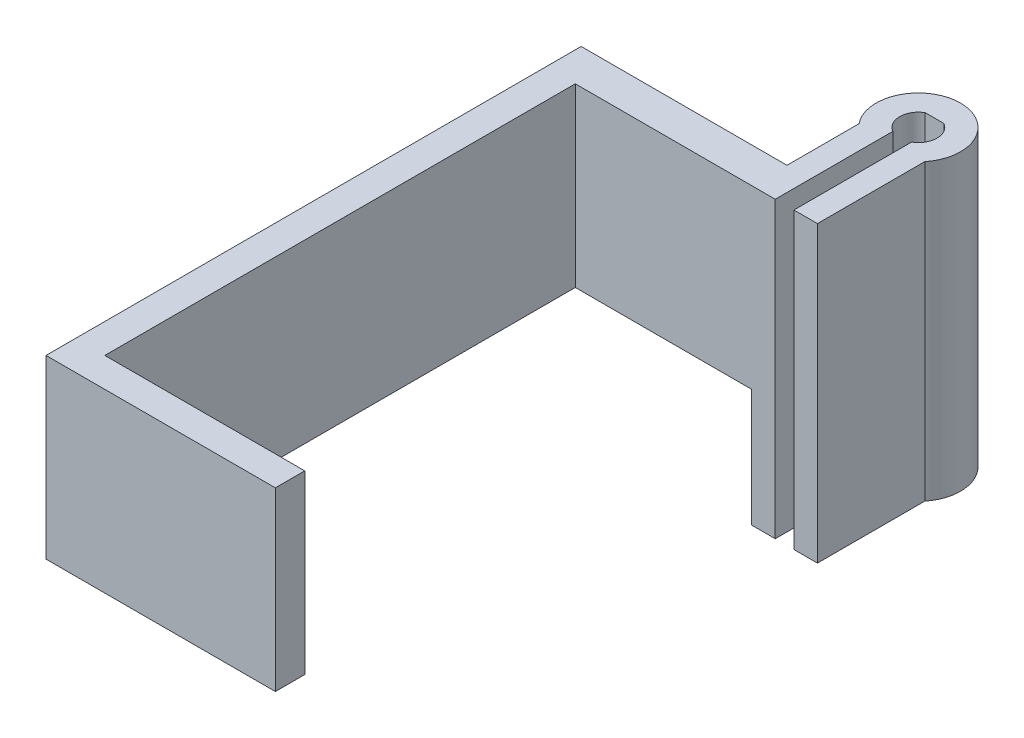
ISO-10303-21;
HEADER;
FILE_DESCRIPTION(('STEP AP214'),'2;1');
FILE_NAME('part.step','',(''),(''),'','','');
FILE_SCHEMA(('AUTOMOTIVE_DESIGN { 1 0 10303 214 1 1 1 1 }'));
ENDSEC;
DATA;
#1=APPLICATION_CONTEXT('core data for automotive mechanical design processes');
#2=APPLICATION_PROTOCOL_DEFINITION('international standard','automotive_design',2000,#1);
#3=PRODUCT_CONTEXT('',#1,'mechanical');
#4=PRODUCT('Part','Part','',(#3));
#5=PRODUCT_RELATED_PRODUCT_CATEGORY('part','',(#4));
#6=PRODUCT_DEFINITION_FORMATION('','',#4);
#7=PRODUCT_DEFINITION_CONTEXT('part definition',#1,'design');
#8=PRODUCT_DEFINITION('design','',#6,#7);
#9=PRODUCT_DEFINITION_SHAPE('','',#8);
#10=(LENGTH_UNIT() NAMED_UNIT(*) SI_UNIT(.MILLI.,.METRE.));
#11=(NAMED_UNIT(*) PLANE_ANGLE_UNIT() SI_UNIT($,.RADIAN.));
#12=(NAMED_UNIT(*) SI_UNIT($,.STERADIAN.) SOLID_ANGLE_UNIT());
#13=UNCERTAINTY_MEASURE_WITH_UNIT(LENGTH_MEASURE(1.E-05),#10,'distance_accuracy_value','');
#14=(GEOMETRIC_REPRESENTATION_CONTEXT(3) GLOBAL_UNCERTAINTY_ASSIGNED_CONTEXT((#13)) GLOBAL_UNIT_ASSIGNED_CONTEXT((#10,
#11,#12)) REPRESENTATION_CONTEXT('',''));
#15=CARTESIAN_POINT('',(0.,0.,0.));
#16=DIRECTION('',(0.,0.,1.));
#17=DIRECTION('',(1.,0.,0.));
#18=AXIS2_PLACEMENT_3D('',#15,#16,#17);
#19=CARTESIAN_POINT('',(0.,50.,0.));
#20=DIRECTION('',(0.,-1.,0.));
#21=DIRECTION('',(0.,0.,-1.));
#22=AXIS2_PLACEMENT_3D('',#19,#20,#21);
#23=CYLINDRICAL_SURFACE('',#22,3.175);
#24=CARTESIAN_POINT('',(0.,0.,0.));
#25=DIRECTION('',(0.,-1.,0.));
#26=DIRECTION('',(0.,0.,1.));
#27=AXIS2_PLACEMENT_3D('',#24,#25,#26);
#28=CIRCLE('',#27,3.175);
#29=CARTESIAN_POINT('',(1.5875,0.,-2.74963065701559));
#30=VERTEX_POINT('',#29);
#31=CARTESIAN_POINT('',(1.5875,0.,2.74963065701559));
#32=VERTEX_POINT('',#31);
#33=EDGE_CURVE('E147',#30,#32,#28,.T.);
#34=ORIENTED_EDGE('',*,*,#33,.T.);
#35=DIRECTION('',(0.,-1.,0.));
#36=VECTOR('',#35,1.);
#37=CARTESIAN_POINT('',(1.5875,50.,2.74963065701559));
#38=LINE('',#37,#36);
#39=CARTESIAN_POINT('',(1.5875,50.,2.74963065701559));
#40=VERTEX_POINT('',#39);
#41=EDGE_CURVE('E11',#40,#32,#38,.T.);
#42=ORIENTED_EDGE('',*,*,#41,.F.);
#43=CARTESIAN_POINT('',(0.,50.,0.));
#44=DIRECTION('',(0.,-1.,0.));
#45=DIRECTION('',(0.,0.,1.));
#46=AXIS2_PLACEMENT_3D('',#43,#44,#45);
#47=CIRCLE('',#46,3.175);
#48=CARTESIAN_POINT('',(1.5875,50.,-2.74963065701559));
#49=VERTEX_POINT('',#48);
#50=EDGE_CURVE('E167',#49,#40,#47,.T.);
#51=ORIENTED_EDGE('',*,*,#50,.F.);
#52=DIRECTION('',(0.,-1.,0.));
#53=VECTOR('',#52,1.);
#54=CARTESIAN_POINT('',(1.5875,50.,-2.74963065701559));
#55=LINE('',#54,#53);
#56=EDGE_CURVE('E143',#49,#30,#55,.T.);
#57=ORIENTED_EDGE('',*,*,#56,.T.);
#58=EDGE_LOOP('',(#34,#42,#51,#57));
#59=FACE_BOUND('',#58,.T.);
#60=ADVANCED_FACE('F37',(#59),#23,.F.);
#61=CARTESIAN_POINT('',(1.5875,50.,2.74963065701559));
#62=DIRECTION('',(1.,0.,0.));
#63=DIRECTION('',(0.,0.,-1.));
#64=AXIS2_PLACEMENT_3D('',#61,#62,#63);
#65=PLANE('',#64);
#66=DIRECTION('',(0.,0.,1.));
#67=VECTOR('',#66,1.);
#68=CARTESIAN_POINT('',(1.5875,0.,2.74963065701559));
#69=LINE('',#68,#67);
#70=CARTESIAN_POINT('',(1.5875,0.,22.7496306570156));
#71=VERTEX_POINT('',#70);
#72=EDGE_CURVE('E150',#32,#71,#69,.T.);
#73=ORIENTED_EDGE('',*,*,#72,.T.);
#74=DIRECTION('',(0.,-1.,0.));
#75=VECTOR('',#74,1.);
#76=CARTESIAN_POINT('',(1.5875,50.,22.7496306570156));
#77=LINE('',#76,#75);
#78=CARTESIAN_POINT('',(1.5875,50.,22.7496306570156));
#79=VERTEX_POINT('',#78);
#80=EDGE_CURVE('E45',#79,#71,#77,.T.);
#81=ORIENTED_EDGE('',*,*,#80,.F.);
#82=DIRECTION('',(0.,0.,1.));
#83=VECTOR('',#82,1.);
#84=CARTESIAN_POINT('',(1.5875,50.,2.74963065701559));
#85=LINE('',#84,#83);
#86=EDGE_CURVE('E103',#40,#79,#85,.T.);
#87=ORIENTED_EDGE('',*,*,#86,.F.);
#88=ORIENTED_EDGE('',*,*,#41,.T.);
#89=EDGE_LOOP('',(#73,#81,#87,#88));
#90=FACE_BOUND('',#89,.T.);
#91=ADVANCED_FACE('F352',(#90),#65,.F.);
#92=CARTESIAN_POINT('',(1.5875,50.,22.7496306570156));
#93=DIRECTION('',(0.,0.,-1.));
#94=DIRECTION('',(-1.,0.,0.));
#95=AXIS2_PLACEMENT_3D('',#92,#93,#94);
#96=PLANE('',#95);
#97=DIRECTION('',(1.,0.,0.));
#98=VECTOR('',#97,1.);
#99=CARTESIAN_POINT('',(1.5875,0.,22.7496306570156));
#100=LINE('',#99,#98);
#101=CARTESIAN_POINT('',(5.5875,0.,22.7496306570156));
#102=VERTEX_POINT('',#101);
#103=EDGE_CURVE('E153',#71,#102,#100,.T.);
#104=ORIENTED_EDGE('',*,*,#103,.T.);
#105=DIRECTION('',(0.,-1.,0.));
#106=VECTOR('',#105,1.);
#107=CARTESIAN_POINT('',(5.5875,50.,22.7496306570156));
#108=LINE('',#107,#106);
#109=CARTESIAN_POINT('',(5.5875,50.,22.7496306570156));
#110=VERTEX_POINT('',#109);
#111=EDGE_CURVE('E179',#110,#102,#108,.T.);
#112=ORIENTED_EDGE('',*,*,#111,.F.);
#113=DIRECTION('',(1.,0.,0.));
#114=VECTOR('',#113,1.);
#115=CARTESIAN_POINT('',(1.5875,50.,22.7496306570156));
#116=LINE('',#115,#114);
#117=EDGE_CURVE('E187',#79,#110,#116,.T.);
#118=ORIENTED_EDGE('',*,*,#117,.F.);
#119=ORIENTED_EDGE('',*,*,#80,.T.);
#120=EDGE_LOOP('',(#104,#112,#118,#119));
#121=FACE_BOUND('',#120,.T.);
#122=ADVANCED_FACE('F185',(#121),#96,.F.);
#123=CARTESIAN_POINT('',(5.5875,50.,4.50116304414759));
#124=DIRECTION('',(-1.,0.,0.));
#125=DIRECTION('',(0.,0.,1.));
#126=AXIS2_PLACEMENT_3D('',#123,#124,#125);
#127=PLANE('',#126);
#128=DIRECTION('',(0.,0.,-1.));
#129=VECTOR('',#128,1.);
#130=CARTESIAN_POINT('',(5.5875,0.,4.50116304414759));
#131=LINE('',#130,#129);
#132=CARTESIAN_POINT('',(5.5875,0.,4.50116304414759));
#133=VERTEX_POINT('',#132);
#134=EDGE_CURVE('E155',#102,#133,#131,.T.);
#135=ORIENTED_EDGE('',*,*,#134,.T.);
#136=DIRECTION('',(0.,-1.,0.));
#137=VECTOR('',#136,1.);
#138=CARTESIAN_POINT('',(5.5875,50.,4.50116304414759));
#139=LINE('',#138,#137);
#140=CARTESIAN_POINT('',(5.5875,50.,4.50116304414759));
#141=VERTEX_POINT('',#140);
#142=EDGE_CURVE('E176',#141,#133,#139,.T.);
#143=ORIENTED_EDGE('',*,*,#142,.F.);
#144=DIRECTION('',(0.,0.,-1.));
#145=VECTOR('',#144,1.);
#146=CARTESIAN_POINT('',(5.5875,50.,4.50116304414759));
#147=LINE('',#146,#145);
#148=EDGE_CURVE('E206',#110,#141,#147,.T.);
#149=ORIENTED_EDGE('',*,*,#148,.F.);
#150=ORIENTED_EDGE('',*,*,#111,.T.);
#151=EDGE_LOOP('',(#135,#143,#149,#150));
#152=FACE_BOUND('',#151,.T.);
#153=ADVANCED_FACE('F196',(#152),#127,.F.);
#154=CARTESIAN_POINT('',(0.,50.,0.));
#155=DIRECTION('',(0.,-1.,0.));
#156=DIRECTION('',(0.,0.,-1.));
#157=AXIS2_PLACEMENT_3D('',#154,#155,#156);
#158=CYLINDRICAL_SURFACE('',#157,7.175);
#159=CARTESIAN_POINT('',(0.,0.,0.));
#160=DIRECTION('',(0.,1.,0.));
#161=DIRECTION('',(0.,0.,1.));
#162=AXIS2_PLACEMENT_3D('',#159,#160,#161);
#163=CIRCLE('',#162,7.175);
#164=CARTESIAN_POINT('',(-5.5875,0.,4.50116304414759));
#165=VERTEX_POINT('',#164);
#166=EDGE_CURVE('E157',#133,#165,#163,.T.);
#167=ORIENTED_EDGE('',*,*,#166,.T.);
#168=DIRECTION('',(0.,-1.,0.));
#169=VECTOR('',#168,1.);
#170=CARTESIAN_POINT('',(-5.5875,50.,4.50116304414759));
#171=LINE('',#170,#169);
#172=CARTESIAN_POINT('',(-5.5875,50.,4.50116304414759));
#173=VERTEX_POINT('',#172);
#174=EDGE_CURVE('E173',#173,#165,#171,.T.);
#175=ORIENTED_EDGE('',*,*,#174,.F.);
#176=CARTESIAN_POINT('',(0.,50.,0.));
#177=DIRECTION('',(0.,1.,0.));
#178=DIRECTION('',(0.,0.,1.));
#179=AXIS2_PLACEMENT_3D('',#176,#177,#178);
#180=CIRCLE('',#179,7.175);
#181=EDGE_CURVE('E202',#141,#173,#180,.T.);
#182=ORIENTED_EDGE('',*,*,#181,.F.);
#183=ORIENTED_EDGE('',*,*,#142,.T.);
#184=EDGE_LOOP('',(#167,#175,#182,#183));
#185=FACE_BOUND('',#184,.T.);
#186=ADVANCED_FACE('F200',(#185),#158,.T.);
#187=CARTESIAN_POINT('',(-5.5875,50.,4.50116304414759));
#188=DIRECTION('',(1.,0.,0.));
#189=DIRECTION('',(0.,0.,-1.));
#190=AXIS2_PLACEMENT_3D('',#187,#188,#189);
#191=PLANE('',#190);
#192=DIRECTION('',(0.,0.,-1.));
#193=VECTOR('',#192,1.);
#194=CARTESIAN_POINT('',(-5.5875,20.,16.7496306570156));
#195=LINE('',#194,#193);
#196=CARTESIAN_POINT('',(-5.5875,20.,22.7496306570156));
#197=VERTEX_POINT('',#196);
#198=CARTESIAN_POINT('',(-5.5875,20.,16.7496306570156));
#199=VERTEX_POINT('',#198);
#200=EDGE_CURVE('E237',#197,#199,#195,.T.);
#201=ORIENTED_EDGE('',*,*,#200,.T.);
#202=DIRECTION('',(0.,1.,0.));
#203=VECTOR('',#202,1.);
#204=CARTESIAN_POINT('',(-5.5875,20.,16.7496306570156));
#205=LINE('',#204,#203);
#206=CARTESIAN_POINT('',(-5.5875,50.,16.7496306570156));
#207=VERTEX_POINT('',#206);
#208=EDGE_CURVE('E214',#199,#207,#205,.T.);
#209=ORIENTED_EDGE('',*,*,#208,.T.);
#210=DIRECTION('',(0.,0.,1.));
#211=VECTOR('',#210,1.);
#212=CARTESIAN_POINT('',(-5.5875,50.,4.50116304414759));
#213=LINE('',#212,#211);
#214=EDGE_CURVE('E205',#173,#207,#213,.T.);
#215=ORIENTED_EDGE('',*,*,#214,.F.);
#216=ORIENTED_EDGE('',*,*,#174,.T.);
#217=DIRECTION('',(0.,0.,1.));
#218=VECTOR('',#217,1.);
#219=CARTESIAN_POINT('',(-5.5875,0.,4.50116304414759));
#220=LINE('',#219,#218);
#221=CARTESIAN_POINT('',(-5.5875,0.,22.7496306570156));
#222=VERTEX_POINT('',#221);
#223=EDGE_CURVE('E159',#165,#222,#220,.T.);
#224=ORIENTED_EDGE('',*,*,#223,.T.);
#225=DIRECTION('',(0.,-1.,0.));
#226=VECTOR('',#225,1.);
#227=CARTESIAN_POINT('',(-5.5875,50.,22.7496306570156));
#228=LINE('',#227,#226);
#229=EDGE_CURVE('E171',#197,#222,#228,.T.);
#230=ORIENTED_EDGE('',*,*,#229,.F.);
#231=EDGE_LOOP('',(#201,#209,#215,#216,#224,#230));
#232=FACE_BOUND('',#231,.T.);
#233=ADVANCED_FACE('F278',(#232),#191,.F.);
#234=CARTESIAN_POINT('',(-5.5875,50.,22.7496306570156));
#235=DIRECTION('',(0.,0.,-1.));
#236=DIRECTION('',(-1.,0.,0.));
#237=AXIS2_PLACEMENT_3D('',#234,#235,#236);
#238=PLANE('',#237);
#239=DIRECTION('',(1.,0.,0.));
#240=VECTOR('',#239,1.);
#241=CARTESIAN_POINT('',(-5.5875,0.,22.7496306570156));
#242=LINE('',#241,#240);
#243=CARTESIAN_POINT('',(-1.5875,0.,22.7496306570156));
#244=VERTEX_POINT('',#243);
#245=EDGE_CURVE('E162',#222,#244,#242,.T.);
#246=ORIENTED_EDGE('',*,*,#245,.T.);
#247=DIRECTION('',(0.,-1.,0.));
#248=VECTOR('',#247,1.);
#249=CARTESIAN_POINT('',(-1.5875,50.,22.7496306570156));
#250=LINE('',#249,#248);
#251=CARTESIAN_POINT('',(-1.5875,50.,22.7496306570156));
#252=VERTEX_POINT('',#251);
#253=EDGE_CURVE('E138',#252,#244,#250,.T.);
#254=ORIENTED_EDGE('',*,*,#253,.F.);
#255=DIRECTION('',(1.,0.,0.));
#256=VECTOR('',#255,1.);
#257=CARTESIAN_POINT('',(-5.5875,50.,22.7496306570156));
#258=LINE('',#257,#256);
#259=CARTESIAN_POINT('',(-35.5875,50.,22.7496306570156));
#260=VERTEX_POINT('',#259);
#261=EDGE_CURVE('E129',#260,#252,#258,.T.);
#262=ORIENTED_EDGE('',*,*,#261,.F.);
#263=DIRECTION('',(0.,1.,0.));
#264=VECTOR('',#263,1.);
#265=CARTESIAN_POINT('',(-35.5875,20.,22.7496306570156));
#266=LINE('',#265,#264);
#267=CARTESIAN_POINT('',(-35.5875,20.,22.7496306570156));
#268=VERTEX_POINT('',#267);
#269=EDGE_CURVE('E151',#268,#260,#266,.T.);
#270=ORIENTED_EDGE('',*,*,#269,.F.);
#271=DIRECTION('',(1.,0.,0.));
#272=VECTOR('',#271,1.);
#273=CARTESIAN_POINT('',(-5.5875,20.,22.7496306570156));
#274=LINE('',#273,#272);
#275=EDGE_CURVE('E218',#268,#197,#274,.T.);
#276=ORIENTED_EDGE('',*,*,#275,.T.);
#277=ORIENTED_EDGE('',*,*,#229,.T.);
#278=EDGE_LOOP('',(#246,#254,#262,#270,#276,#277));
#279=FACE_BOUND('',#278,.T.);
#280=ADVANCED_FACE('F293',(#279),#238,.F.);
#281=CARTESIAN_POINT('',(-1.5875,50.,2.74963065701559));
#282=DIRECTION('',(-1.,0.,0.));
#283=DIRECTION('',(0.,0.,1.));
#284=AXIS2_PLACEMENT_3D('',#281,#282,#283);
#285=PLANE('',#284);
#286=DIRECTION('',(0.,0.,-1.));
#287=VECTOR('',#286,1.);
#288=CARTESIAN_POINT('',(-1.5875,0.,2.74963065701559));
#289=LINE('',#288,#287);
#290=CARTESIAN_POINT('',(-1.5875,0.,2.74963065701559));
#291=VERTEX_POINT('',#290);
#292=EDGE_CURVE('E137',#244,#291,#289,.T.);
#293=ORIENTED_EDGE('',*,*,#292,.T.);
#294=DIRECTION('',(0.,-1.,0.));
#295=VECTOR('',#294,1.);
#296=CARTESIAN_POINT('',(-1.5875,50.,2.74963065701559));
#297=LINE('',#296,#295);
#298=CARTESIAN_POINT('',(-1.5875,50.,2.74963065701559));
#299=VERTEX_POINT('',#298);
#300=EDGE_CURVE('E134',#299,#291,#297,.T.);
#301=ORIENTED_EDGE('',*,*,#300,.F.);
#302=DIRECTION('',(0.,0.,-1.));
#303=VECTOR('',#302,1.);
#304=CARTESIAN_POINT('',(-1.5875,50.,2.74963065701559));
#305=LINE('',#304,#303);
#306=EDGE_CURVE('E122',#252,#299,#305,.T.);
#307=ORIENTED_EDGE('',*,*,#306,.F.);
#308=ORIENTED_EDGE('',*,*,#253,.T.);
#309=EDGE_LOOP('',(#293,#301,#307,#308));
#310=FACE_BOUND('',#309,.T.);
#311=ADVANCED_FACE('F135',(#310),#285,.F.);
#312=CARTESIAN_POINT('',(0.,50.,0.));
#313=DIRECTION('',(0.,-1.,0.));
#314=DIRECTION('',(0.,0.,-1.));
#315=AXIS2_PLACEMENT_3D('',#312,#313,#314);
#316=CYLINDRICAL_SURFACE('',#315,3.175);
#317=CARTESIAN_POINT('',(0.,0.,0.));
#318=DIRECTION('',(0.,-1.,0.));
#319=DIRECTION('',(0.,0.,1.));
#320=AXIS2_PLACEMENT_3D('',#317,#318,#319);
#321=CIRCLE('',#320,3.175);
#322=CARTESIAN_POINT('',(-1.5875,0.,-2.74963065701559));
#323=VERTEX_POINT('',#322);
#324=EDGE_CURVE('E89',#291,#323,#321,.T.);
#325=ORIENTED_EDGE('',*,*,#324,.T.);
#326=DIRECTION('',(0.,-1.,0.));
#327=VECTOR('',#326,1.);
#328=CARTESIAN_POINT('',(-1.5875,50.,-2.74963065701559));
#329=LINE('',#328,#327);
#330=CARTESIAN_POINT('',(-1.5875,50.,-2.74963065701559));
#331=VERTEX_POINT('',#330);
#332=EDGE_CURVE('E139',#331,#323,#329,.T.);
#333=ORIENTED_EDGE('',*,*,#332,.F.);
#334=CARTESIAN_POINT('',(0.,50.,0.));
#335=DIRECTION('',(0.,-1.,0.));
#336=DIRECTION('',(0.,0.,1.));
#337=AXIS2_PLACEMENT_3D('',#334,#335,#336);
#338=CIRCLE('',#337,3.175);
#339=EDGE_CURVE('E126',#299,#331,#338,.T.);
#340=ORIENTED_EDGE('',*,*,#339,.F.);
#341=ORIENTED_EDGE('',*,*,#300,.T.);
#342=EDGE_LOOP('',(#325,#333,#340,#341));
#343=FACE_BOUND('',#342,.T.);
#344=ADVANCED_FACE('F141',(#343),#316,.F.);
#345=CARTESIAN_POINT('',(1.5875,50.,-2.74963065701559));
#346=DIRECTION('',(0.,0.,-1.));
#347=DIRECTION('',(-1.,0.,0.));
#348=AXIS2_PLACEMENT_3D('',#345,#346,#347);
#349=PLANE('',#348);
#350=DIRECTION('',(1.,0.,0.));
#351=VECTOR('',#350,1.);
#352=CARTESIAN_POINT('',(1.5875,0.,-2.74963065701559));
#353=LINE('',#352,#351);
#354=EDGE_CURVE('E95',#323,#30,#353,.T.);
#355=ORIENTED_EDGE('',*,*,#354,.T.);
#356=ORIENTED_EDGE('',*,*,#56,.F.);
#357=DIRECTION('',(1.,0.,0.));
#358=VECTOR('',#357,1.);
#359=CARTESIAN_POINT('',(1.5875,50.,-2.74963065701559));
#360=LINE('',#359,#358);
#361=EDGE_CURVE('E53',#331,#49,#360,.T.);
#362=ORIENTED_EDGE('',*,*,#361,.F.);
#363=ORIENTED_EDGE('',*,*,#332,.T.);
#364=EDGE_LOOP('',(#355,#356,#362,#363));
#365=FACE_BOUND('',#364,.T.);
#366=ADVANCED_FACE('F341',(#365),#349,.F.);
#367=CARTESIAN_POINT('',(0.,50.,0.));
#368=DIRECTION('',(0.,1.,0.));
#369=DIRECTION('',(0.,0.,1.));
#370=AXIS2_PLACEMENT_3D('',#367,#368,#369);
#371=PLANE('',#370);
#372=ORIENTED_EDGE('',*,*,#50,.T.);
#373=ORIENTED_EDGE('',*,*,#86,.T.);
#374=ORIENTED_EDGE('',*,*,#117,.T.);
#375=ORIENTED_EDGE('',*,*,#148,.T.);
#376=ORIENTED_EDGE('',*,*,#181,.T.);
#377=ORIENTED_EDGE('',*,*,#214,.T.);
#378=DIRECTION('',(-1.,0.,0.));
#379=VECTOR('',#378,1.);
#380=CARTESIAN_POINT('',(-40.5875,50.,16.7496306570156));
#381=LINE('',#380,#379);
#382=CARTESIAN_POINT('',(-40.5875,50.,16.7496306570156));
#383=VERTEX_POINT('',#382);
#384=EDGE_CURVE('E250',#207,#383,#381,.T.);
#385=ORIENTED_EDGE('',*,*,#384,.T.);
#386=DIRECTION('',(0.,0.,1.));
#387=VECTOR('',#386,1.);
#388=CARTESIAN_POINT('',(-40.5875,50.,107.749630657016));
#389=LINE('',#388,#387);
#390=CARTESIAN_POINT('',(-40.5875,50.,107.749630657016));
#391=VERTEX_POINT('',#390);
#392=EDGE_CURVE('E247',#383,#391,#389,.T.);
#393=ORIENTED_EDGE('',*,*,#392,.T.);
#394=DIRECTION('',(1.,0.,0.));
#395=VECTOR('',#394,1.);
#396=CARTESIAN_POINT('',(-1.58749999999999,50.,107.749630657016));
#397=LINE('',#396,#395);
#398=CARTESIAN_POINT('',(-1.58749999999999,50.,107.749630657016));
#399=VERTEX_POINT('',#398);
#400=EDGE_CURVE('E244',#391,#399,#397,.T.);
#401=ORIENTED_EDGE('',*,*,#400,.T.);
#402=DIRECTION('',(0.,0.,-1.));
#403=VECTOR('',#402,1.);
#404=CARTESIAN_POINT('',(-1.58749999999999,50.,102.749630657016));
#405=LINE('',#404,#403);
#406=CARTESIAN_POINT('',(-1.58749999999999,50.,102.749630657016));
#407=VERTEX_POINT('',#406);
#408=EDGE_CURVE('E241',#399,#407,#405,.T.);
#409=ORIENTED_EDGE('',*,*,#408,.T.);
#410=DIRECTION('',(-1.,0.,0.));
#411=VECTOR('',#410,1.);
#412=CARTESIAN_POINT('',(-35.5875,50.,102.749630657016));
#413=LINE('',#412,#411);
#414=CARTESIAN_POINT('',(-35.5875,50.,102.749630657016));
#415=VERTEX_POINT('',#414);
#416=EDGE_CURVE('E238',#407,#415,#413,.T.);
#417=ORIENTED_EDGE('',*,*,#416,.T.);
#418=DIRECTION('',(0.,0.,-1.));
#419=VECTOR('',#418,1.);
#420=CARTESIAN_POINT('',(-35.5875,50.,22.7496306570156));
#421=LINE('',#420,#419);
#422=EDGE_CURVE('E235',#415,#260,#421,.T.);
#423=ORIENTED_EDGE('',*,*,#422,.T.);
#424=ORIENTED_EDGE('',*,*,#261,.T.);
#425=ORIENTED_EDGE('',*,*,#306,.T.);
#426=ORIENTED_EDGE('',*,*,#339,.T.);
#427=ORIENTED_EDGE('',*,*,#361,.T.);
#428=EDGE_LOOP('',(#372,#373,#374,#375,#376,#377,#385,#393,#401,#409,#417,#423,#424,#425,#426,#427));
#429=FACE_BOUND('',#428,.T.);
#430=ADVANCED_FACE('F124',(#429),#371,.T.);
#431=CARTESIAN_POINT('',(0.,0.,0.));
#432=DIRECTION('',(0.,1.,0.));
#433=DIRECTION('',(0.,0.,1.));
#434=AXIS2_PLACEMENT_3D('',#431,#432,#433);
#435=PLANE('',#434);
#436=ORIENTED_EDGE('',*,*,#33,.F.);
#437=ORIENTED_EDGE('',*,*,#354,.F.);
#438=ORIENTED_EDGE('',*,*,#324,.F.);
#439=ORIENTED_EDGE('',*,*,#292,.F.);
#440=ORIENTED_EDGE('',*,*,#245,.F.);
#441=ORIENTED_EDGE('',*,*,#223,.F.);
#442=ORIENTED_EDGE('',*,*,#166,.F.);
#443=ORIENTED_EDGE('',*,*,#134,.F.);
#444=ORIENTED_EDGE('',*,*,#103,.F.);
#445=ORIENTED_EDGE('',*,*,#72,.F.);
#446=EDGE_LOOP('',(#436,#437,#438,#439,#440,#441,#442,#443,#444,#445));
#447=FACE_BOUND('',#446,.T.);
#448=ADVANCED_FACE('F191',(#447),#435,.F.);
#449=CARTESIAN_POINT('',(-35.5875,20.,22.7496306570156));
#450=DIRECTION('',(1.,0.,0.));
#451=DIRECTION('',(0.,0.,-1.));
#452=AXIS2_PLACEMENT_3D('',#449,#450,#451);
#453=PLANE('',#452);
#454=ORIENTED_EDGE('',*,*,#422,.F.);
#455=DIRECTION('',(0.,1.,0.));
#456=VECTOR('',#455,1.);
#457=CARTESIAN_POINT('',(-35.5875,20.,102.749630657016));
#458=LINE('',#457,#456);
#459=CARTESIAN_POINT('',(-35.5875,20.,102.749630657016));
#460=VERTEX_POINT('',#459);
#461=EDGE_CURVE('E230',#460,#415,#458,.T.);
#462=ORIENTED_EDGE('',*,*,#461,.F.);
#463=DIRECTION('',(0.,0.,-1.));
#464=VECTOR('',#463,1.);
#465=CARTESIAN_POINT('',(-35.5875,20.,22.7496306570156));
#466=LINE('',#465,#464);
#467=EDGE_CURVE('E255',#460,#268,#466,.T.);
#468=ORIENTED_EDGE('',*,*,#467,.T.);
#469=ORIENTED_EDGE('',*,*,#269,.T.);
#470=EDGE_LOOP('',(#454,#462,#468,#469));
#471=FACE_BOUND('',#470,.T.);
#472=ADVANCED_FACE('F299',(#471),#453,.T.);
#473=CARTESIAN_POINT('',(-35.5875,20.,102.749630657016));
#474=DIRECTION('',(0.,0.,-1.));
#475=DIRECTION('',(-1.,0.,0.));
#476=AXIS2_PLACEMENT_3D('',#473,#474,#475);
#477=PLANE('',#476);
#478=ORIENTED_EDGE('',*,*,#416,.F.);
#479=DIRECTION('',(0.,1.,0.));
#480=VECTOR('',#479,1.);
#481=CARTESIAN_POINT('',(-1.58749999999999,20.,102.749630657016));
#482=LINE('',#481,#480);
#483=CARTESIAN_POINT('',(-1.58749999999999,20.,102.749630657016));
#484=VERTEX_POINT('',#483);
#485=EDGE_CURVE('E227',#484,#407,#482,.T.);
#486=ORIENTED_EDGE('',*,*,#485,.F.);
#487=DIRECTION('',(-1.,0.,0.));
#488=VECTOR('',#487,1.);
#489=CARTESIAN_POINT('',(-35.5875,20.,102.749630657016));
#490=LINE('',#489,#488);
#491=EDGE_CURVE('E258',#484,#460,#490,.T.);
#492=ORIENTED_EDGE('',*,*,#491,.T.);
#493=ORIENTED_EDGE('',*,*,#461,.T.);
#494=EDGE_LOOP('',(#478,#486,#492,#493));
#495=FACE_BOUND('',#494,.T.);
#496=ADVANCED_FACE('F307',(#495),#477,.T.);
#497=CARTESIAN_POINT('',(-1.58749999999999,20.,102.749630657016));
#498=DIRECTION('',(1.,0.,0.));
#499=DIRECTION('',(0.,0.,-1.));
#500=AXIS2_PLACEMENT_3D('',#497,#498,#499);
#501=PLANE('',#500);
#502=ORIENTED_EDGE('',*,*,#408,.F.);
#503=DIRECTION('',(0.,1.,0.));
#504=VECTOR('',#503,1.);
#505=CARTESIAN_POINT('',(-1.58749999999999,20.,107.749630657016));
#506=LINE('',#505,#504);
#507=CARTESIAN_POINT('',(-1.58749999999999,20.,107.749630657016));
#508=VERTEX_POINT('',#507);
#509=EDGE_CURVE('E224',#508,#399,#506,.T.);
#510=ORIENTED_EDGE('',*,*,#509,.F.);
#511=DIRECTION('',(0.,0.,-1.));
#512=VECTOR('',#511,1.);
#513=CARTESIAN_POINT('',(-1.58749999999999,20.,102.749630657016));
#514=LINE('',#513,#512);
#515=EDGE_CURVE('E261',#508,#484,#514,.T.);
#516=ORIENTED_EDGE('',*,*,#515,.T.);
#517=ORIENTED_EDGE('',*,*,#485,.T.);
#518=EDGE_LOOP('',(#502,#510,#516,#517));
#519=FACE_BOUND('',#518,.T.);
#520=ADVANCED_FACE('F314',(#519),#501,.T.);
#521=CARTESIAN_POINT('',(-1.58749999999999,20.,107.749630657016));
#522=DIRECTION('',(0.,0.,1.));
#523=DIRECTION('',(1.,0.,0.));
#524=AXIS2_PLACEMENT_3D('',#521,#522,#523);
#525=PLANE('',#524);
#526=ORIENTED_EDGE('',*,*,#400,.F.);
#527=DIRECTION('',(0.,1.,0.));
#528=VECTOR('',#527,1.);
#529=CARTESIAN_POINT('',(-40.5875,20.,107.749630657016));
#530=LINE('',#529,#528);
#531=CARTESIAN_POINT('',(-40.5875,20.,107.749630657016));
#532=VERTEX_POINT('',#531);
#533=EDGE_CURVE('E221',#532,#391,#530,.T.);
#534=ORIENTED_EDGE('',*,*,#533,.F.);
#535=DIRECTION('',(1.,0.,0.));
#536=VECTOR('',#535,1.);
#537=CARTESIAN_POINT('',(-1.58749999999999,20.,107.749630657016));
#538=LINE('',#537,#536);
#539=EDGE_CURVE('E264',#532,#508,#538,.T.);
#540=ORIENTED_EDGE('',*,*,#539,.T.);
#541=ORIENTED_EDGE('',*,*,#509,.T.);
#542=EDGE_LOOP('',(#526,#534,#540,#541));
#543=FACE_BOUND('',#542,.T.);
#544=ADVANCED_FACE('F440',(#543),#525,.T.);
#545=CARTESIAN_POINT('',(-40.5875,20.,107.749630657016));
#546=DIRECTION('',(-1.,0.,0.));
#547=DIRECTION('',(0.,0.,1.));
#548=AXIS2_PLACEMENT_3D('',#545,#546,#547);
#549=PLANE('',#548);
#550=ORIENTED_EDGE('',*,*,#392,.F.);
#551=DIRECTION('',(0.,1.,0.));
#552=VECTOR('',#551,1.);
#553=CARTESIAN_POINT('',(-40.5875,20.,16.7496306570156));
#554=LINE('',#553,#552);
#555=CARTESIAN_POINT('',(-40.5875,20.,16.7496306570156));
#556=VERTEX_POINT('',#555);
#557=EDGE_CURVE('E217',#556,#383,#554,.T.);
#558=ORIENTED_EDGE('',*,*,#557,.F.);
#559=DIRECTION('',(0.,0.,1.));
#560=VECTOR('',#559,1.);
#561=CARTESIAN_POINT('',(-40.5875,20.,107.749630657016));
#562=LINE('',#561,#560);
#563=EDGE_CURVE('E267',#556,#532,#562,.T.);
#564=ORIENTED_EDGE('',*,*,#563,.T.);
#565=ORIENTED_EDGE('',*,*,#533,.T.);
#566=EDGE_LOOP('',(#550,#558,#564,#565));
#567=FACE_BOUND('',#566,.T.);
#568=ADVANCED_FACE('F333',(#567),#549,.T.);
#569=CARTESIAN_POINT('',(-40.5875,20.,16.7496306570156));
#570=DIRECTION('',(0.,0.,-1.));
#571=DIRECTION('',(-1.,0.,0.));
#572=AXIS2_PLACEMENT_3D('',#569,#570,#571);
#573=PLANE('',#572);
#574=ORIENTED_EDGE('',*,*,#384,.F.);
#575=ORIENTED_EDGE('',*,*,#208,.F.);
#576=DIRECTION('',(-1.,0.,0.));
#577=VECTOR('',#576,1.);
#578=CARTESIAN_POINT('',(-40.5875,20.,16.7496306570156));
#579=LINE('',#578,#577);
#580=EDGE_CURVE('E270',#199,#556,#579,.T.);
#581=ORIENTED_EDGE('',*,*,#580,.T.);
#582=ORIENTED_EDGE('',*,*,#557,.T.);
#583=EDGE_LOOP('',(#574,#575,#581,#582));
#584=FACE_BOUND('',#583,.T.);
#585=ADVANCED_FACE('F336',(#584),#573,.T.);
#586=CARTESIAN_POINT('',(0.,20.,0.));
#587=DIRECTION('',(0.,-1.,0.));
#588=DIRECTION('',(0.,0.,-1.));
#589=AXIS2_PLACEMENT_3D('',#586,#587,#588);
#590=PLANE('',#589);
#591=ORIENTED_EDGE('',*,*,#200,.F.);
#592=ORIENTED_EDGE('',*,*,#275,.F.);
#593=ORIENTED_EDGE('',*,*,#467,.F.);
#594=ORIENTED_EDGE('',*,*,#491,.F.);
#595=ORIENTED_EDGE('',*,*,#515,.F.);
#596=ORIENTED_EDGE('',*,*,#539,.F.);
#597=ORIENTED_EDGE('',*,*,#563,.F.);
#598=ORIENTED_EDGE('',*,*,#580,.F.);
#599=EDGE_LOOP('',(#591,#592,#593,#594,#595,#596,#597,#598));
#600=FACE_BOUND('',#599,.T.);
#601=ADVANCED_FACE('F286',(#600),#590,.T.);
#602=CLOSED_SHELL('',(#60,#91,#122,#153,#186,#233,#280,#311,#344,#366,#430,#448,#472,#496,#520,
#544,#568,#585,#601));
#603=MANIFOLD_SOLID_BREP('B2',#602);
#604=ADVANCED_BREP_SHAPE_REPRESENTATION('',(#18,#603),#14);
#605=SHAPE_DEFINITION_REPRESENTATION(#9,#604);
ENDSEC;
END-ISO-10303-21;
